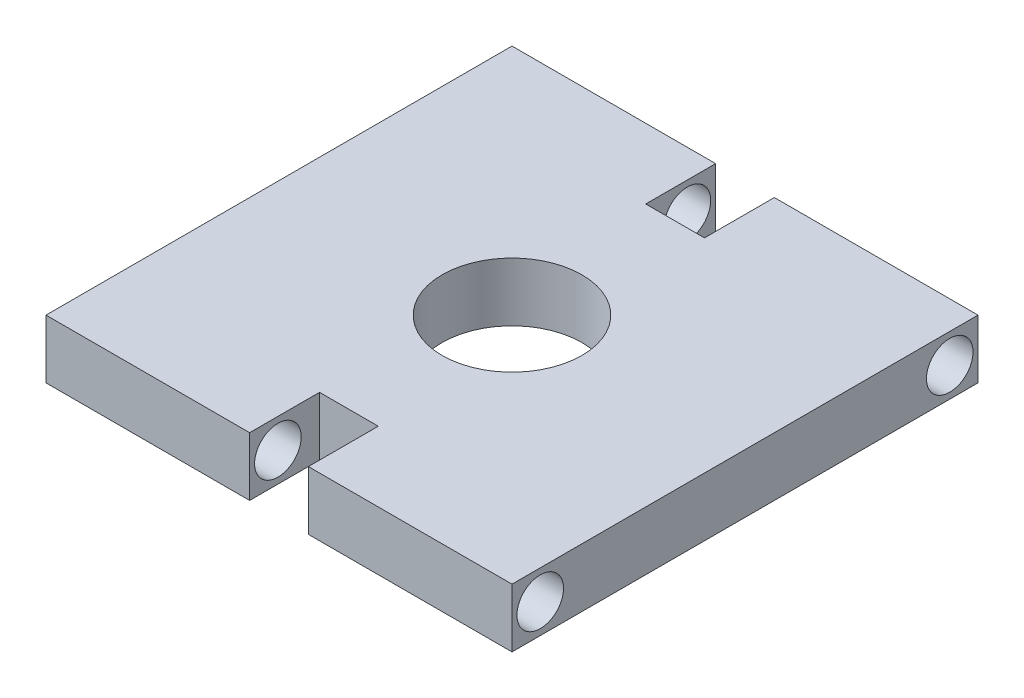
ISO-10303-21;
HEADER;
FILE_DESCRIPTION(('STEP AP214'),'2;1');
FILE_NAME('part.step','',(''),(''),'','','');
FILE_SCHEMA(('AUTOMOTIVE_DESIGN { 1 0 10303 214 1 1 1 1 }'));
ENDSEC;
DATA;
#1=APPLICATION_CONTEXT('core data for automotive mechanical design processes');
#2=APPLICATION_PROTOCOL_DEFINITION('international standard','automotive_design',2000,#1);
#3=PRODUCT_CONTEXT('',#1,'mechanical');
#4=PRODUCT('Part','Part','',(#3));
#5=PRODUCT_RELATED_PRODUCT_CATEGORY('part','',(#4));
#6=PRODUCT_DEFINITION_FORMATION('','',#4);
#7=PRODUCT_DEFINITION_CONTEXT('part definition',#1,'design');
#8=PRODUCT_DEFINITION('design','',#6,#7);
#9=PRODUCT_DEFINITION_SHAPE('','',#8);
#10=(LENGTH_UNIT() NAMED_UNIT(*) SI_UNIT(.MILLI.,.METRE.));
#11=(NAMED_UNIT(*) PLANE_ANGLE_UNIT() SI_UNIT($,.RADIAN.));
#12=(NAMED_UNIT(*) SI_UNIT($,.STERADIAN.) SOLID_ANGLE_UNIT());
#13=UNCERTAINTY_MEASURE_WITH_UNIT(LENGTH_MEASURE(1.E-05),#10,'distance_accuracy_value','');
#14=(GEOMETRIC_REPRESENTATION_CONTEXT(3) GLOBAL_UNCERTAINTY_ASSIGNED_CONTEXT((#13)) GLOBAL_UNIT_ASSIGNED_CONTEXT((#10,
#11,#12)) REPRESENTATION_CONTEXT('',''));
#15=CARTESIAN_POINT('',(0.,0.,0.));
#16=DIRECTION('',(0.,0.,1.));
#17=DIRECTION('',(1.,0.,0.));
#18=AXIS2_PLACEMENT_3D('',#15,#16,#17);
#19=CARTESIAN_POINT('',(25.4,3.2004,0.));
#20=DIRECTION('',(-1.,0.,0.));
#21=DIRECTION('',(0.,0.,1.));
#22=AXIS2_PLACEMENT_3D('',#19,#20,#21);
#23=PLANE('',#22);
#24=DIRECTION('',(0.,0.,-1.));
#25=VECTOR('',#24,1.);
#26=CARTESIAN_POINT('',(25.4,0.,0.));
#27=LINE('',#26,#25);
#28=CARTESIAN_POINT('',(25.4,0.,0.));
#29=VERTEX_POINT('',#28);
#30=CARTESIAN_POINT('',(25.4,0.,-25.4));
#31=VERTEX_POINT('',#30);
#32=EDGE_CURVE('E155',#29,#31,#27,.T.);
#33=ORIENTED_EDGE('',*,*,#32,.T.);
#34=DIRECTION('',(0.,-1.,0.));
#35=VECTOR('',#34,1.);
#36=CARTESIAN_POINT('',(25.4,3.2004,-25.4));
#37=LINE('',#36,#35);
#38=CARTESIAN_POINT('',(25.4,3.2004,-25.4));
#39=VERTEX_POINT('',#38);
#40=EDGE_CURVE('E11',#39,#31,#37,.T.);
#41=ORIENTED_EDGE('',*,*,#40,.F.);
#42=DIRECTION('',(0.,0.,-1.));
#43=VECTOR('',#42,1.);
#44=CARTESIAN_POINT('',(25.4,3.2004,0.));
#45=LINE('',#44,#43);
#46=CARTESIAN_POINT('',(25.4,3.2004,0.));
#47=VERTEX_POINT('',#46);
#48=EDGE_CURVE('E178',#47,#39,#45,.T.);
#49=ORIENTED_EDGE('',*,*,#48,.F.);
#50=DIRECTION('',(0.,-1.,0.));
#51=VECTOR('',#50,1.);
#52=CARTESIAN_POINT('',(25.4,3.2004,0.));
#53=LINE('',#52,#51);
#54=EDGE_CURVE('E151',#47,#29,#53,.T.);
#55=ORIENTED_EDGE('',*,*,#54,.T.);
#56=EDGE_LOOP('',(#33,#41,#49,#55));
#57=FACE_BOUND('',#56,.T.);
#58=CARTESIAN_POINT('',(25.4,1.6002,-23.8601649178149));
#59=DIRECTION('',(1.,0.,0.));
#60=DIRECTION('',(0.,0.,-1.));
#61=AXIS2_PLACEMENT_3D('',#58,#59,#60);
#62=CIRCLE('',#61,1.27);
#63=CARTESIAN_POINT('',(25.4,1.6002,-25.1301649178149));
#64=VERTEX_POINT('',#63);
#65=EDGE_CURVE('E317',#64,#64,#62,.T.);
#66=ORIENTED_EDGE('',*,*,#65,.F.);
#67=EDGE_LOOP('',(#66));
#68=FACE_BOUND('',#67,.T.);
#69=CARTESIAN_POINT('',(25.4,1.6002,-1.53983508218514));
#70=DIRECTION('',(-1.,0.,0.));
#71=DIRECTION('',(0.,0.,1.));
#72=AXIS2_PLACEMENT_3D('',#69,#70,#71);
#73=CIRCLE('',#72,1.27);
#74=CARTESIAN_POINT('',(25.4,1.6002,-0.269835082185144));
#75=VERTEX_POINT('',#74);
#76=EDGE_CURVE('E323',#75,#75,#73,.T.);
#77=ORIENTED_EDGE('',*,*,#76,.T.);
#78=EDGE_LOOP('',(#77));
#79=FACE_BOUND('',#78,.T.);
#80=ADVANCED_FACE('F32',(#57,#68,#79),#23,.F.);
#81=CARTESIAN_POINT('',(0.,3.2004,0.));
#82=DIRECTION('',(1.,0.,0.));
#83=DIRECTION('',(0.,0.,-1.));
#84=AXIS2_PLACEMENT_3D('',#81,#82,#83);
#85=PLANE('',#84);
#86=DIRECTION('',(0.,0.,1.));
#87=VECTOR('',#86,1.);
#88=CARTESIAN_POINT('',(0.,0.,0.));
#89=LINE('',#88,#87);
#90=CARTESIAN_POINT('',(0.,0.,-25.4));
#91=VERTEX_POINT('',#90);
#92=CARTESIAN_POINT('',(0.,0.,0.));
#93=VERTEX_POINT('',#92);
#94=EDGE_CURVE('E169',#91,#93,#89,.T.);
#95=ORIENTED_EDGE('',*,*,#94,.T.);
#96=DIRECTION('',(0.,-1.,0.));
#97=VECTOR('',#96,1.);
#98=CARTESIAN_POINT('',(0.,3.2004,0.));
#99=LINE('',#98,#97);
#100=CARTESIAN_POINT('',(0.,3.2004,0.));
#101=VERTEX_POINT('',#100);
#102=EDGE_CURVE('E185',#101,#93,#99,.T.);
#103=ORIENTED_EDGE('',*,*,#102,.F.);
#104=DIRECTION('',(0.,0.,1.));
#105=VECTOR('',#104,1.);
#106=CARTESIAN_POINT('',(0.,3.2004,0.));
#107=LINE('',#106,#105);
#108=CARTESIAN_POINT('',(0.,3.2004,-25.4));
#109=VERTEX_POINT('',#108);
#110=EDGE_CURVE('E227',#109,#101,#107,.T.);
#111=ORIENTED_EDGE('',*,*,#110,.F.);
#112=DIRECTION('',(0.,-1.,0.));
#113=VECTOR('',#112,1.);
#114=CARTESIAN_POINT('',(0.,3.2004,-25.4));
#115=LINE('',#114,#113);
#116=EDGE_CURVE('E188',#109,#91,#115,.T.);
#117=ORIENTED_EDGE('',*,*,#116,.T.);
#118=EDGE_LOOP('',(#95,#103,#111,#117));
#119=FACE_BOUND('',#118,.T.);
#120=CARTESIAN_POINT('',(0.,1.6002,-23.8601649178149));
#121=DIRECTION('',(1.,0.,0.));
#122=DIRECTION('',(0.,0.,-1.));
#123=AXIS2_PLACEMENT_3D('',#120,#121,#122);
#124=CIRCLE('',#123,1.27);
#125=CARTESIAN_POINT('',(0.,1.6002,-25.1301649178149));
#126=VERTEX_POINT('',#125);
#127=EDGE_CURVE('E320',#126,#126,#124,.T.);
#128=ORIENTED_EDGE('',*,*,#127,.T.);
#129=EDGE_LOOP('',(#128));
#130=FACE_BOUND('',#129,.T.);
#131=CARTESIAN_POINT('',(0.,1.6002,-1.53983508218514));
#132=DIRECTION('',(-1.,0.,0.));
#133=DIRECTION('',(0.,0.,1.));
#134=AXIS2_PLACEMENT_3D('',#131,#132,#133);
#135=CIRCLE('',#134,1.27);
#136=CARTESIAN_POINT('',(0.,1.6002,-0.269835082185144));
#137=VERTEX_POINT('',#136);
#138=EDGE_CURVE('E313',#137,#137,#135,.T.);
#139=ORIENTED_EDGE('',*,*,#138,.F.);
#140=EDGE_LOOP('',(#139));
#141=FACE_BOUND('',#140,.T.);
#142=ADVANCED_FACE('F264',(#119,#130,#141),#85,.F.);
#143=CARTESIAN_POINT('',(11.0998,3.2004,0.));
#144=DIRECTION('',(-1.,0.,0.));
#145=DIRECTION('',(0.,0.,1.));
#146=AXIS2_PLACEMENT_3D('',#143,#144,#145);
#147=PLANE('',#146);
#148=DIRECTION('',(0.,0.,-1.));
#149=VECTOR('',#148,1.);
#150=CARTESIAN_POINT('',(11.0998,0.,0.));
#151=LINE('',#150,#149);
#152=CARTESIAN_POINT('',(11.0998,0.,0.));
#153=VERTEX_POINT('',#152);
#154=CARTESIAN_POINT('',(11.0998,0.,-3.81));
#155=VERTEX_POINT('',#154);
#156=EDGE_CURVE('E173',#153,#155,#151,.T.);
#157=ORIENTED_EDGE('',*,*,#156,.T.);
#158=DIRECTION('',(0.,-1.,0.));
#159=VECTOR('',#158,1.);
#160=CARTESIAN_POINT('',(11.0998,3.2004,-3.81));
#161=LINE('',#160,#159);
#162=CARTESIAN_POINT('',(11.0998,3.2004,-3.81));
#163=VERTEX_POINT('',#162);
#164=EDGE_CURVE('E145',#163,#155,#161,.T.);
#165=ORIENTED_EDGE('',*,*,#164,.F.);
#166=DIRECTION('',(0.,0.,-1.));
#167=VECTOR('',#166,1.);
#168=CARTESIAN_POINT('',(11.0998,3.2004,0.));
#169=LINE('',#168,#167);
#170=CARTESIAN_POINT('',(11.0998,3.2004,0.));
#171=VERTEX_POINT('',#170);
#172=EDGE_CURVE('E136',#171,#163,#169,.T.);
#173=ORIENTED_EDGE('',*,*,#172,.F.);
#174=DIRECTION('',(0.,-1.,0.));
#175=VECTOR('',#174,1.);
#176=CARTESIAN_POINT('',(11.0998,3.2004,0.));
#177=LINE('',#176,#175);
#178=EDGE_CURVE('E182',#171,#153,#177,.T.);
#179=ORIENTED_EDGE('',*,*,#178,.T.);
#180=EDGE_LOOP('',(#157,#165,#173,#179));
#181=FACE_BOUND('',#180,.T.);
#182=CARTESIAN_POINT('',(11.0998,1.6002,-1.53983508218514));
#183=DIRECTION('',(-1.,0.,0.));
#184=DIRECTION('',(0.,0.,1.));
#185=AXIS2_PLACEMENT_3D('',#182,#183,#184);
#186=CIRCLE('',#185,1.27);
#187=CARTESIAN_POINT('',(11.0998,1.6002,-0.269835082185144));
#188=VERTEX_POINT('',#187);
#189=EDGE_CURVE('E316',#188,#188,#186,.F.);
#190=ORIENTED_EDGE('',*,*,#189,.F.);
#191=EDGE_LOOP('',(#190));
#192=FACE_BOUND('',#191,.T.);
#193=ADVANCED_FACE('F243',(#181,#192),#147,.F.);
#194=CARTESIAN_POINT('',(14.3002,3.2004,0.));
#195=DIRECTION('',(1.,0.,0.));
#196=DIRECTION('',(0.,0.,-1.));
#197=AXIS2_PLACEMENT_3D('',#194,#195,#196);
#198=PLANE('',#197);
#199=DIRECTION('',(0.,0.,1.));
#200=VECTOR('',#199,1.);
#201=CARTESIAN_POINT('',(14.3002,0.,0.));
#202=LINE('',#201,#200);
#203=CARTESIAN_POINT('',(14.3002,0.,-3.81));
#204=VERTEX_POINT('',#203);
#205=CARTESIAN_POINT('',(14.3002,0.,0.));
#206=VERTEX_POINT('',#205);
#207=EDGE_CURVE('E90',#204,#206,#202,.T.);
#208=ORIENTED_EDGE('',*,*,#207,.T.);
#209=DIRECTION('',(0.,-1.,0.));
#210=VECTOR('',#209,1.);
#211=CARTESIAN_POINT('',(14.3002,3.2004,0.));
#212=LINE('',#211,#210);
#213=CARTESIAN_POINT('',(14.3002,3.2004,0.));
#214=VERTEX_POINT('',#213);
#215=EDGE_CURVE('E146',#214,#206,#212,.T.);
#216=ORIENTED_EDGE('',*,*,#215,.F.);
#217=DIRECTION('',(0.,0.,1.));
#218=VECTOR('',#217,1.);
#219=CARTESIAN_POINT('',(14.3002,3.2004,0.));
#220=LINE('',#219,#218);
#221=CARTESIAN_POINT('',(14.3002,3.2004,-3.81));
#222=VERTEX_POINT('',#221);
#223=EDGE_CURVE('E134',#222,#214,#220,.T.);
#224=ORIENTED_EDGE('',*,*,#223,.F.);
#225=DIRECTION('',(0.,-1.,0.));
#226=VECTOR('',#225,1.);
#227=CARTESIAN_POINT('',(14.3002,3.2004,-3.81));
#228=LINE('',#227,#226);
#229=EDGE_CURVE('E141',#222,#204,#228,.T.);
#230=ORIENTED_EDGE('',*,*,#229,.T.);
#231=EDGE_LOOP('',(#208,#216,#224,#230));
#232=FACE_BOUND('',#231,.T.);
#233=CARTESIAN_POINT('',(14.3002,1.6002,-1.53983508218514));
#234=DIRECTION('',(1.,0.,0.));
#235=DIRECTION('',(0.,0.,-1.));
#236=AXIS2_PLACEMENT_3D('',#233,#234,#235);
#237=CIRCLE('',#236,1.27);
#238=CARTESIAN_POINT('',(14.3002,1.6002,-2.80983508218514));
#239=VERTEX_POINT('',#238);
#240=EDGE_CURVE('E35',#239,#239,#237,.F.);
#241=ORIENTED_EDGE('',*,*,#240,.F.);
#242=EDGE_LOOP('',(#241));
#243=FACE_BOUND('',#242,.T.);
#244=ADVANCED_FACE('F148',(#232,#243),#198,.F.);
#245=CARTESIAN_POINT('',(0.,3.2004,0.));
#246=DIRECTION('',(0.,-1.,0.));
#247=DIRECTION('',(0.,0.,-1.));
#248=AXIS2_PLACEMENT_3D('',#245,#246,#247);
#249=PLANE('',#248);
#250=ORIENTED_EDGE('',*,*,#48,.T.);
#251=DIRECTION('',(-1.,0.,0.));
#252=VECTOR('',#251,1.);
#253=CARTESIAN_POINT('',(14.3002,3.2004,-25.4));
#254=LINE('',#253,#252);
#255=CARTESIAN_POINT('',(14.3002,3.2004,-25.4));
#256=VERTEX_POINT('',#255);
#257=EDGE_CURVE('E104',#39,#256,#254,.T.);
#258=ORIENTED_EDGE('',*,*,#257,.T.);
#259=DIRECTION('',(0.,0.,1.));
#260=VECTOR('',#259,1.);
#261=CARTESIAN_POINT('',(14.3002,3.2004,-25.4));
#262=LINE('',#261,#260);
#263=CARTESIAN_POINT('',(14.3002,3.2004,-21.59));
#264=VERTEX_POINT('',#263);
#265=EDGE_CURVE('E206',#256,#264,#262,.T.);
#266=ORIENTED_EDGE('',*,*,#265,.T.);
#267=DIRECTION('',(-1.,0.,0.));
#268=VECTOR('',#267,1.);
#269=CARTESIAN_POINT('',(11.0998,3.2004,-21.59));
#270=LINE('',#269,#268);
#271=CARTESIAN_POINT('',(11.0998,3.2004,-21.59));
#272=VERTEX_POINT('',#271);
#273=EDGE_CURVE('E225',#264,#272,#270,.T.);
#274=ORIENTED_EDGE('',*,*,#273,.T.);
#275=DIRECTION('',(0.,0.,-1.));
#276=VECTOR('',#275,1.);
#277=CARTESIAN_POINT('',(11.0998,3.2004,-25.4));
#278=LINE('',#277,#276);
#279=CARTESIAN_POINT('',(11.0998,3.2004,-25.4));
#280=VERTEX_POINT('',#279);
#281=EDGE_CURVE('E222',#272,#280,#278,.T.);
#282=ORIENTED_EDGE('',*,*,#281,.T.);
#283=DIRECTION('',(-1.,0.,0.));
#284=VECTOR('',#283,1.);
#285=CARTESIAN_POINT('',(0.,3.2004,-25.4));
#286=LINE('',#285,#284);
#287=EDGE_CURVE('E224',#280,#109,#286,.T.);
#288=ORIENTED_EDGE('',*,*,#287,.T.);
#289=ORIENTED_EDGE('',*,*,#110,.T.);
#290=DIRECTION('',(1.,0.,0.));
#291=VECTOR('',#290,1.);
#292=CARTESIAN_POINT('',(0.,3.2004,0.));
#293=LINE('',#292,#291);
#294=EDGE_CURVE('E233',#101,#171,#293,.T.);
#295=ORIENTED_EDGE('',*,*,#294,.T.);
#296=ORIENTED_EDGE('',*,*,#172,.T.);
#297=DIRECTION('',(1.,0.,0.));
#298=VECTOR('',#297,1.);
#299=CARTESIAN_POINT('',(11.0998,3.2004,-3.81));
#300=LINE('',#299,#298);
#301=EDGE_CURVE('E129',#163,#222,#300,.T.);
#302=ORIENTED_EDGE('',*,*,#301,.T.);
#303=ORIENTED_EDGE('',*,*,#223,.T.);
#304=DIRECTION('',(1.,0.,0.));
#305=VECTOR('',#304,1.);
#306=CARTESIAN_POINT('',(14.3002,3.2004,0.));
#307=LINE('',#306,#305);
#308=EDGE_CURVE('E49',#214,#47,#307,.T.);
#309=ORIENTED_EDGE('',*,*,#308,.T.);
#310=EDGE_LOOP('',(#250,#258,#266,#274,#282,#288,#289,#295,#296,#302,#303,#309));
#311=FACE_BOUND('',#310,.T.);
#312=CARTESIAN_POINT('',(12.7,3.2004,-12.7));
#313=DIRECTION('',(0.,1.,0.));
#314=DIRECTION('',(0.,0.,1.));
#315=AXIS2_PLACEMENT_3D('',#312,#313,#314);
#316=CIRCLE('',#315,3.81);
#317=CARTESIAN_POINT('',(12.7,3.2004,-8.89));
#318=VERTEX_POINT('',#317);
#319=EDGE_CURVE('E159',#318,#318,#316,.T.);
#320=ORIENTED_EDGE('',*,*,#319,.F.);
#321=EDGE_LOOP('',(#320));
#322=FACE_BOUND('',#321,.T.);
#323=ADVANCED_FACE('F131',(#311,#322),#249,.F.);
#324=CARTESIAN_POINT('',(0.,0.,0.));
#325=DIRECTION('',(0.,-1.,0.));
#326=DIRECTION('',(0.,0.,-1.));
#327=AXIS2_PLACEMENT_3D('',#324,#325,#326);
#328=PLANE('',#327);
#329=ORIENTED_EDGE('',*,*,#32,.F.);
#330=DIRECTION('',(1.,0.,0.));
#331=VECTOR('',#330,1.);
#332=CARTESIAN_POINT('',(14.3002,0.,0.));
#333=LINE('',#332,#331);
#334=EDGE_CURVE('E96',#206,#29,#333,.T.);
#335=ORIENTED_EDGE('',*,*,#334,.F.);
#336=ORIENTED_EDGE('',*,*,#207,.F.);
#337=DIRECTION('',(1.,0.,0.));
#338=VECTOR('',#337,1.);
#339=CARTESIAN_POINT('',(11.0998,0.,-3.81));
#340=LINE('',#339,#338);
#341=EDGE_CURVE('E144',#155,#204,#340,.T.);
#342=ORIENTED_EDGE('',*,*,#341,.F.);
#343=ORIENTED_EDGE('',*,*,#156,.F.);
#344=DIRECTION('',(1.,0.,0.));
#345=VECTOR('',#344,1.);
#346=CARTESIAN_POINT('',(0.,0.,0.));
#347=LINE('',#346,#345);
#348=EDGE_CURVE('E171',#93,#153,#347,.T.);
#349=ORIENTED_EDGE('',*,*,#348,.F.);
#350=ORIENTED_EDGE('',*,*,#94,.F.);
#351=DIRECTION('',(-1.,0.,0.));
#352=VECTOR('',#351,1.);
#353=CARTESIAN_POINT('',(0.,0.,-25.4));
#354=LINE('',#353,#352);
#355=CARTESIAN_POINT('',(11.0998,0.,-25.4));
#356=VERTEX_POINT('',#355);
#357=EDGE_CURVE('E167',#356,#91,#354,.T.);
#358=ORIENTED_EDGE('',*,*,#357,.F.);
#359=DIRECTION('',(0.,0.,-1.));
#360=VECTOR('',#359,1.);
#361=CARTESIAN_POINT('',(11.0998,0.,-25.4));
#362=LINE('',#361,#360);
#363=CARTESIAN_POINT('',(11.0998,0.,-21.59));
#364=VERTEX_POINT('',#363);
#365=EDGE_CURVE('E165',#364,#356,#362,.T.);
#366=ORIENTED_EDGE('',*,*,#365,.F.);
#367=DIRECTION('',(-1.,0.,0.));
#368=VECTOR('',#367,1.);
#369=CARTESIAN_POINT('',(11.0998,0.,-21.59));
#370=LINE('',#369,#368);
#371=CARTESIAN_POINT('',(14.3002,0.,-21.59));
#372=VERTEX_POINT('',#371);
#373=EDGE_CURVE('E163',#372,#364,#370,.T.);
#374=ORIENTED_EDGE('',*,*,#373,.F.);
#375=DIRECTION('',(0.,0.,1.));
#376=VECTOR('',#375,1.);
#377=CARTESIAN_POINT('',(14.3002,0.,-25.4));
#378=LINE('',#377,#376);
#379=CARTESIAN_POINT('',(14.3002,0.,-25.4));
#380=VERTEX_POINT('',#379);
#381=EDGE_CURVE('E161',#380,#372,#378,.T.);
#382=ORIENTED_EDGE('',*,*,#381,.F.);
#383=DIRECTION('',(-1.,0.,0.));
#384=VECTOR('',#383,1.);
#385=CARTESIAN_POINT('',(14.3002,0.,-25.4));
#386=LINE('',#385,#384);
#387=EDGE_CURVE('E158',#31,#380,#386,.T.);
#388=ORIENTED_EDGE('',*,*,#387,.F.);
#389=EDGE_LOOP('',(#329,#335,#336,#342,#343,#349,#350,#358,#366,#374,#382,#388));
#390=FACE_BOUND('',#389,.T.);
#391=CARTESIAN_POINT('',(12.7,0.,-12.7));
#392=DIRECTION('',(0.,1.,0.));
#393=DIRECTION('',(0.,0.,1.));
#394=AXIS2_PLACEMENT_3D('',#391,#392,#393);
#395=CIRCLE('',#394,3.81);
#396=CARTESIAN_POINT('',(12.7,0.,-8.89));
#397=VERTEX_POINT('',#396);
#398=EDGE_CURVE('E335',#397,#397,#395,.T.);
#399=ORIENTED_EDGE('',*,*,#398,.T.);
#400=EDGE_LOOP('',(#399));
#401=FACE_BOUND('',#400,.T.);
#402=ADVANCED_FACE('F210',(#390,#401),#328,.T.);
#403=CARTESIAN_POINT('',(14.3002,3.2004,-25.4));
#404=DIRECTION('',(0.,0.,1.));
#405=DIRECTION('',(1.,0.,0.));
#406=AXIS2_PLACEMENT_3D('',#403,#404,#405);
#407=PLANE('',#406);
#408=ORIENTED_EDGE('',*,*,#387,.T.);
#409=DIRECTION('',(0.,-1.,0.));
#410=VECTOR('',#409,1.);
#411=CARTESIAN_POINT('',(14.3002,3.2004,-25.4));
#412=LINE('',#411,#410);
#413=EDGE_CURVE('E41',#256,#380,#412,.T.);
#414=ORIENTED_EDGE('',*,*,#413,.F.);
#415=ORIENTED_EDGE('',*,*,#257,.F.);
#416=ORIENTED_EDGE('',*,*,#40,.T.);
#417=EDGE_LOOP('',(#408,#414,#415,#416));
#418=FACE_BOUND('',#417,.T.);
#419=ADVANCED_FACE('F287',(#418),#407,.F.);
#420=CARTESIAN_POINT('',(14.3002,3.2004,-25.4));
#421=DIRECTION('',(1.,0.,0.));
#422=DIRECTION('',(0.,0.,-1.));
#423=AXIS2_PLACEMENT_3D('',#420,#421,#422);
#424=PLANE('',#423);
#425=CARTESIAN_POINT('',(14.3002,1.6002,-23.8601649178149));
#426=DIRECTION('',(1.,0.,0.));
#427=DIRECTION('',(0.,0.,-1.));
#428=AXIS2_PLACEMENT_3D('',#425,#426,#427);
#429=CIRCLE('',#428,1.27);
#430=CARTESIAN_POINT('',(14.3002,1.6002,-25.1301649178149));
#431=VERTEX_POINT('',#430);
#432=EDGE_CURVE('E332',#431,#431,#429,.T.);
#433=ORIENTED_EDGE('',*,*,#432,.T.);
#434=EDGE_LOOP('',(#433));
#435=FACE_BOUND('',#434,.T.);
#436=ORIENTED_EDGE('',*,*,#381,.T.);
#437=DIRECTION('',(0.,-1.,0.));
#438=VECTOR('',#437,1.);
#439=CARTESIAN_POINT('',(14.3002,3.2004,-21.59));
#440=LINE('',#439,#438);
#441=EDGE_CURVE('E197',#264,#372,#440,.T.);
#442=ORIENTED_EDGE('',*,*,#441,.F.);
#443=ORIENTED_EDGE('',*,*,#265,.F.);
#444=ORIENTED_EDGE('',*,*,#413,.T.);
#445=EDGE_LOOP('',(#436,#442,#443,#444));
#446=FACE_BOUND('',#445,.T.);
#447=ADVANCED_FACE('F204',(#435,#446),#424,.F.);
#448=CARTESIAN_POINT('',(11.0998,3.2004,-21.59));
#449=DIRECTION('',(0.,0.,1.));
#450=DIRECTION('',(1.,0.,0.));
#451=AXIS2_PLACEMENT_3D('',#448,#449,#450);
#452=PLANE('',#451);
#453=ORIENTED_EDGE('',*,*,#373,.T.);
#454=DIRECTION('',(0.,-1.,0.));
#455=VECTOR('',#454,1.);
#456=CARTESIAN_POINT('',(11.0998,3.2004,-21.59));
#457=LINE('',#456,#455);
#458=EDGE_CURVE('E194',#272,#364,#457,.T.);
#459=ORIENTED_EDGE('',*,*,#458,.F.);
#460=ORIENTED_EDGE('',*,*,#273,.F.);
#461=ORIENTED_EDGE('',*,*,#441,.T.);
#462=EDGE_LOOP('',(#453,#459,#460,#461));
#463=FACE_BOUND('',#462,.T.);
#464=ADVANCED_FACE('F216',(#463),#452,.F.);
#465=CARTESIAN_POINT('',(11.0998,3.2004,-25.4));
#466=DIRECTION('',(-1.,0.,0.));
#467=DIRECTION('',(0.,0.,1.));
#468=AXIS2_PLACEMENT_3D('',#465,#466,#467);
#469=PLANE('',#468);
#470=CARTESIAN_POINT('',(11.0998,1.6002,-23.8601649178149));
#471=DIRECTION('',(-1.,0.,0.));
#472=DIRECTION('',(0.,0.,1.));
#473=AXIS2_PLACEMENT_3D('',#470,#471,#472);
#474=CIRCLE('',#473,1.27);
#475=CARTESIAN_POINT('',(11.0998,1.6002,-22.5901649178149));
#476=VERTEX_POINT('',#475);
#477=EDGE_CURVE('E328',#476,#476,#474,.T.);
#478=ORIENTED_EDGE('',*,*,#477,.T.);
#479=EDGE_LOOP('',(#478));
#480=FACE_BOUND('',#479,.T.);
#481=ORIENTED_EDGE('',*,*,#365,.T.);
#482=DIRECTION('',(0.,-1.,0.));
#483=VECTOR('',#482,1.);
#484=CARTESIAN_POINT('',(11.0998,3.2004,-25.4));
#485=LINE('',#484,#483);
#486=EDGE_CURVE('E191',#280,#356,#485,.T.);
#487=ORIENTED_EDGE('',*,*,#486,.F.);
#488=ORIENTED_EDGE('',*,*,#281,.F.);
#489=ORIENTED_EDGE('',*,*,#458,.T.);
#490=EDGE_LOOP('',(#481,#487,#488,#489));
#491=FACE_BOUND('',#490,.T.);
#492=ADVANCED_FACE('F220',(#480,#491),#469,.F.);
#493=CARTESIAN_POINT('',(0.,3.2004,-25.4));
#494=DIRECTION('',(0.,0.,1.));
#495=DIRECTION('',(1.,0.,0.));
#496=AXIS2_PLACEMENT_3D('',#493,#494,#495);
#497=PLANE('',#496);
#498=ORIENTED_EDGE('',*,*,#357,.T.);
#499=ORIENTED_EDGE('',*,*,#116,.F.);
#500=ORIENTED_EDGE('',*,*,#287,.F.);
#501=ORIENTED_EDGE('',*,*,#486,.T.);
#502=EDGE_LOOP('',(#498,#499,#500,#501));
#503=FACE_BOUND('',#502,.T.);
#504=ADVANCED_FACE('F277',(#503),#497,.F.);
#505=CARTESIAN_POINT('',(0.,3.2004,0.));
#506=DIRECTION('',(0.,0.,-1.));
#507=DIRECTION('',(-1.,0.,0.));
#508=AXIS2_PLACEMENT_3D('',#505,#506,#507);
#509=PLANE('',#508);
#510=ORIENTED_EDGE('',*,*,#348,.T.);
#511=ORIENTED_EDGE('',*,*,#178,.F.);
#512=ORIENTED_EDGE('',*,*,#294,.F.);
#513=ORIENTED_EDGE('',*,*,#102,.T.);
#514=EDGE_LOOP('',(#510,#511,#512,#513));
#515=FACE_BOUND('',#514,.T.);
#516=ADVANCED_FACE('F239',(#515),#509,.F.);
#517=CARTESIAN_POINT('',(11.0998,3.2004,-3.81));
#518=DIRECTION('',(0.,0.,-1.));
#519=DIRECTION('',(-1.,0.,0.));
#520=AXIS2_PLACEMENT_3D('',#517,#518,#519);
#521=PLANE('',#520);
#522=ORIENTED_EDGE('',*,*,#341,.T.);
#523=ORIENTED_EDGE('',*,*,#229,.F.);
#524=ORIENTED_EDGE('',*,*,#301,.F.);
#525=ORIENTED_EDGE('',*,*,#164,.T.);
#526=EDGE_LOOP('',(#522,#523,#524,#525));
#527=FACE_BOUND('',#526,.T.);
#528=ADVANCED_FACE('F142',(#527),#521,.F.);
#529=CARTESIAN_POINT('',(14.3002,3.2004,0.));
#530=DIRECTION('',(0.,0.,-1.));
#531=DIRECTION('',(-1.,0.,0.));
#532=AXIS2_PLACEMENT_3D('',#529,#530,#531);
#533=PLANE('',#532);
#534=ORIENTED_EDGE('',*,*,#334,.T.);
#535=ORIENTED_EDGE('',*,*,#54,.F.);
#536=ORIENTED_EDGE('',*,*,#308,.F.);
#537=ORIENTED_EDGE('',*,*,#215,.T.);
#538=EDGE_LOOP('',(#534,#535,#536,#537));
#539=FACE_BOUND('',#538,.T.);
#540=ADVANCED_FACE('F249',(#539),#533,.F.);
#541=CARTESIAN_POINT('',(12.7,3.2004,-12.7));
#542=DIRECTION('',(0.,-1.,0.));
#543=DIRECTION('',(0.,0.,-1.));
#544=AXIS2_PLACEMENT_3D('',#541,#542,#543);
#545=CYLINDRICAL_SURFACE('',#544,3.81);
#546=ORIENTED_EDGE('',*,*,#319,.T.);
#547=EDGE_LOOP('',(#546));
#548=FACE_BOUND('',#547,.T.);
#549=ORIENTED_EDGE('',*,*,#398,.F.);
#550=EDGE_LOOP('',(#549));
#551=FACE_BOUND('',#550,.T.);
#552=ADVANCED_FACE('F251',(#548,#551),#545,.F.);
#553=CARTESIAN_POINT('',(0.,1.6002,-23.8601649178149));
#554=DIRECTION('',(1.,0.,0.));
#555=DIRECTION('',(0.,0.,-1.));
#556=AXIS2_PLACEMENT_3D('',#553,#554,#555);
#557=CYLINDRICAL_SURFACE('',#556,1.27);
#558=ORIENTED_EDGE('',*,*,#127,.F.);
#559=EDGE_LOOP('',(#558));
#560=FACE_BOUND('',#559,.T.);
#561=ORIENTED_EDGE('',*,*,#477,.F.);
#562=EDGE_LOOP('',(#561));
#563=FACE_BOUND('',#562,.T.);
#564=ADVANCED_FACE('F257',(#560,#563),#557,.F.);
#565=ORIENTED_EDGE('',*,*,#65,.T.);
#566=EDGE_LOOP('',(#565));
#567=FACE_BOUND('',#566,.T.);
#568=ORIENTED_EDGE('',*,*,#432,.F.);
#569=EDGE_LOOP('',(#568));
#570=FACE_BOUND('',#569,.T.);
#571=ADVANCED_FACE('F298',(#567,#570),#557,.F.);
#572=CARTESIAN_POINT('',(0.,1.6002,-1.53983508218514));
#573=DIRECTION('',(1.,0.,0.));
#574=DIRECTION('',(0.,0.,-1.));
#575=AXIS2_PLACEMENT_3D('',#572,#573,#574);
#576=CYLINDRICAL_SURFACE('',#575,1.27);
#577=ORIENTED_EDGE('',*,*,#76,.F.);
#578=EDGE_LOOP('',(#577));
#579=FACE_BOUND('',#578,.T.);
#580=ORIENTED_EDGE('',*,*,#240,.T.);
#581=EDGE_LOOP('',(#580));
#582=FACE_BOUND('',#581,.T.);
#583=ADVANCED_FACE('F301',(#579,#582),#576,.F.);
#584=ORIENTED_EDGE('',*,*,#138,.T.);
#585=EDGE_LOOP('',(#584));
#586=FACE_BOUND('',#585,.T.);
#587=ORIENTED_EDGE('',*,*,#189,.T.);
#588=EDGE_LOOP('',(#587));
#589=FACE_BOUND('',#588,.T.);
#590=ADVANCED_FACE('F303',(#586,#589),#576,.F.);
#591=CLOSED_SHELL('',(#80,#142,#193,#244,#323,#402,#419,#447,#464,#492,#504,#516,#528,#540,#552,
#564,#571,#583,#590));
#592=MANIFOLD_SOLID_BREP('B2',#591);
#593=ADVANCED_BREP_SHAPE_REPRESENTATION('',(#18,#592),#14);
#594=SHAPE_DEFINITION_REPRESENTATION(#9,#593);
ENDSEC;
END-ISO-10303-21;
